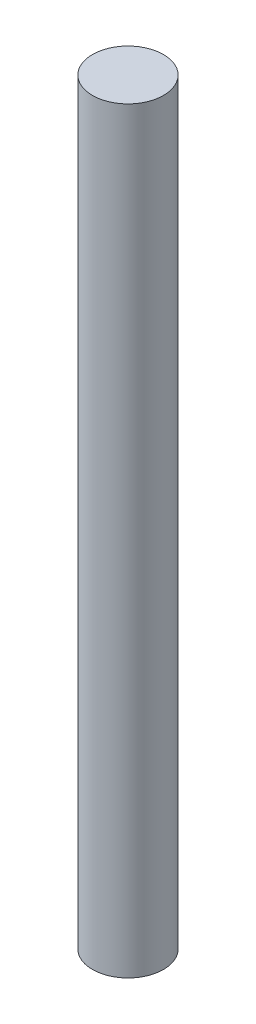
ISO-10303-21;
HEADER;
FILE_DESCRIPTION(('STEP AP214'),'2;1');
FILE_NAME('part.step','',(''),(''),'','','');
FILE_SCHEMA(('AUTOMOTIVE_DESIGN { 1 0 10303 214 1 1 1 1 }'));
ENDSEC;
DATA;
#1=APPLICATION_CONTEXT('core data for automotive mechanical design processes');
#2=APPLICATION_PROTOCOL_DEFINITION('international standard','automotive_design',2000,#1);
#3=PRODUCT_CONTEXT('',#1,'mechanical');
#4=PRODUCT('Part','Part','',(#3));
#5=PRODUCT_RELATED_PRODUCT_CATEGORY('part','',(#4));
#6=PRODUCT_DEFINITION_FORMATION('','',#4);
#7=PRODUCT_DEFINITION_CONTEXT('part definition',#1,'design');
#8=PRODUCT_DEFINITION('design','',#6,#7);
#9=PRODUCT_DEFINITION_SHAPE('','',#8);
#10=(LENGTH_UNIT() NAMED_UNIT(*) SI_UNIT(.MILLI.,.METRE.));
#11=(NAMED_UNIT(*) PLANE_ANGLE_UNIT() SI_UNIT($,.RADIAN.));
#12=(NAMED_UNIT(*) SI_UNIT($,.STERADIAN.) SOLID_ANGLE_UNIT());
#13=UNCERTAINTY_MEASURE_WITH_UNIT(LENGTH_MEASURE(1.E-05),#10,'distance_accuracy_value','');
#14=(GEOMETRIC_REPRESENTATION_CONTEXT(3) GLOBAL_UNCERTAINTY_ASSIGNED_CONTEXT((#13)) GLOBAL_UNIT_ASSIGNED_CONTEXT((#10,
#11,#12)) REPRESENTATION_CONTEXT('',''));
#15=CARTESIAN_POINT('',(0.,0.,0.));
#16=DIRECTION('',(0.,0.,1.));
#17=DIRECTION('',(1.,0.,0.));
#18=AXIS2_PLACEMENT_3D('',#15,#16,#17);
#19=CARTESIAN_POINT('',(0.,32.,0.));
#20=DIRECTION('',(0.,-1.,0.));
#21=DIRECTION('',(0.,0.,-1.));
#22=AXIS2_PLACEMENT_3D('',#19,#20,#21);
#23=CYLINDRICAL_SURFACE('',#22,1.5);
#24=CARTESIAN_POINT('',(0.,32.,0.));
#25=DIRECTION('',(0.,1.,0.));
#26=DIRECTION('',(0.,0.,1.));
#27=AXIS2_PLACEMENT_3D('',#24,#25,#26);
#28=CIRCLE('',#27,1.5);
#29=CARTESIAN_POINT('',(0.,32.,1.5));
#30=VERTEX_POINT('',#29);
#31=EDGE_CURVE('E10',#30,#30,#28,.T.);
#32=ORIENTED_EDGE('',*,*,#31,.F.);
#33=EDGE_LOOP('',(#32));
#34=FACE_BOUND('',#33,.T.);
#35=CARTESIAN_POINT('',(0.,0.,0.));
#36=DIRECTION('',(0.,1.,0.));
#37=DIRECTION('',(0.,0.,1.));
#38=AXIS2_PLACEMENT_3D('',#35,#36,#37);
#39=CIRCLE('',#38,1.5);
#40=CARTESIAN_POINT('',(0.,0.,1.5));
#41=VERTEX_POINT('',#40);
#42=EDGE_CURVE('E40',#41,#41,#39,.T.);
#43=ORIENTED_EDGE('',*,*,#42,.T.);
#44=EDGE_LOOP('',(#43));
#45=FACE_BOUND('',#44,.T.);
#46=ADVANCED_FACE('F37',(#34,#45),#23,.T.);
#47=CARTESIAN_POINT('',(0.,32.,0.));
#48=DIRECTION('',(0.,1.,0.));
#49=DIRECTION('',(0.,0.,1.));
#50=AXIS2_PLACEMENT_3D('',#47,#48,#49);
#51=PLANE('',#50);
#52=ORIENTED_EDGE('',*,*,#31,.T.);
#53=EDGE_LOOP('',(#52));
#54=FACE_BOUND('',#53,.T.);
#55=ADVANCED_FACE('F52',(#54),#51,.T.);
#56=CARTESIAN_POINT('',(0.,0.,0.));
#57=DIRECTION('',(0.,1.,0.));
#58=DIRECTION('',(0.,0.,1.));
#59=AXIS2_PLACEMENT_3D('',#56,#57,#58);
#60=PLANE('',#59);
#61=ORIENTED_EDGE('',*,*,#42,.F.);
#62=EDGE_LOOP('',(#61));
#63=FACE_BOUND('',#62,.T.);
#64=ADVANCED_FACE('F50',(#63),#60,.F.);
#65=CLOSED_SHELL('',(#46,#55,#64));
#66=MANIFOLD_SOLID_BREP('B2',#65);
#67=ADVANCED_BREP_SHAPE_REPRESENTATION('',(#18,#66),#14);
#68=SHAPE_DEFINITION_REPRESENTATION(#9,#67);
ENDSEC;
END-ISO-10303-21;
